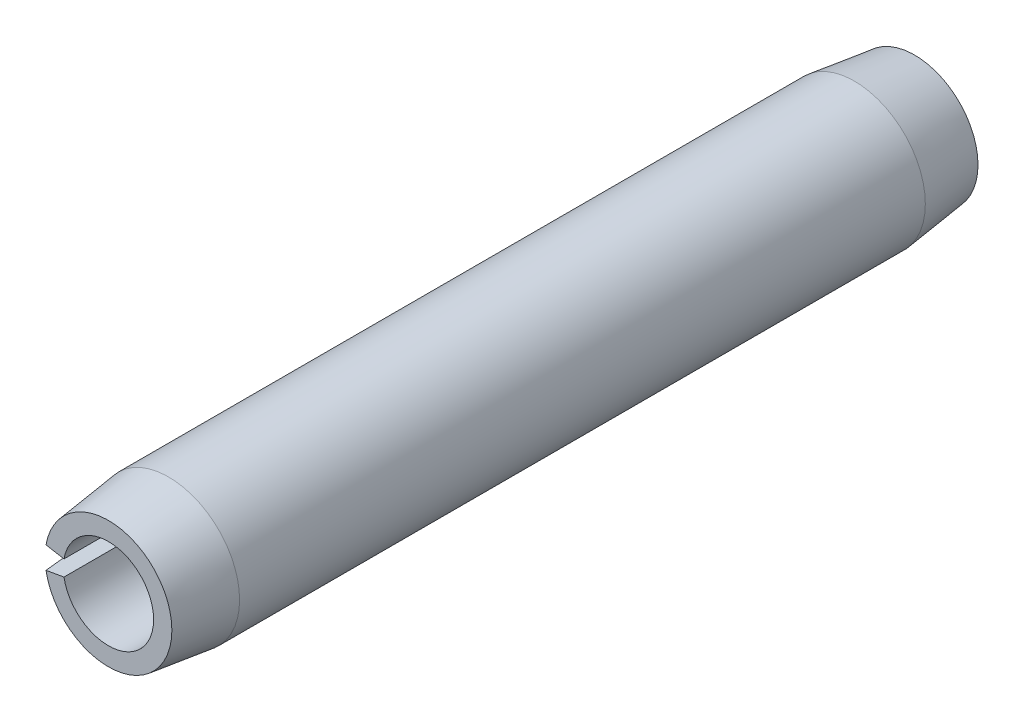
ISO-10303-21;
HEADER;
FILE_DESCRIPTION(('STEP AP214'),'2;1');
FILE_NAME('part.step','',(''),(''),'','','');
FILE_SCHEMA(('AUTOMOTIVE_DESIGN { 1 0 10303 214 1 1 1 1 }'));
ENDSEC;
DATA;
#1=APPLICATION_CONTEXT('core data for automotive mechanical design processes');
#2=APPLICATION_PROTOCOL_DEFINITION('international standard','automotive_design',2000,#1);
#3=PRODUCT_CONTEXT('',#1,'mechanical');
#4=PRODUCT('Part','Part','',(#3));
#5=PRODUCT_RELATED_PRODUCT_CATEGORY('part','',(#4));
#6=PRODUCT_DEFINITION_FORMATION('','',#4);
#7=PRODUCT_DEFINITION_CONTEXT('part definition',#1,'design');
#8=PRODUCT_DEFINITION('design','',#6,#7);
#9=PRODUCT_DEFINITION_SHAPE('','',#8);
#10=(LENGTH_UNIT() NAMED_UNIT(*) SI_UNIT(.MILLI.,.METRE.));
#11=(NAMED_UNIT(*) PLANE_ANGLE_UNIT() SI_UNIT($,.RADIAN.));
#12=(NAMED_UNIT(*) SI_UNIT($,.STERADIAN.) SOLID_ANGLE_UNIT());
#13=UNCERTAINTY_MEASURE_WITH_UNIT(LENGTH_MEASURE(1.E-05),#10,'distance_accuracy_value','');
#14=(GEOMETRIC_REPRESENTATION_CONTEXT(3) GLOBAL_UNCERTAINTY_ASSIGNED_CONTEXT((#13)) GLOBAL_UNIT_ASSIGNED_CONTEXT((#10,
#11,#12)) REPRESENTATION_CONTEXT('',''));
#15=CARTESIAN_POINT('',(0.,0.,0.));
#16=DIRECTION('',(0.,0.,1.));
#17=DIRECTION('',(1.,0.,0.));
#18=AXIS2_PLACEMENT_3D('',#15,#16,#17);
#19=CARTESIAN_POINT('',(0.,0.,4.7625));
#20=DIRECTION('',(0.,0.,-1.));
#21=DIRECTION('',(-1.,0.,0.));
#22=AXIS2_PLACEMENT_3D('',#19,#20,#21);
#23=CYLINDRICAL_SURFACE('',#22,0.5334);
#24=CARTESIAN_POINT('',(0.,0.,-4.7625));
#25=DIRECTION('',(0.,0.,-1.));
#26=DIRECTION('',(1.,0.,0.));
#27=AXIS2_PLACEMENT_3D('',#24,#25,#26);
#28=CIRCLE('',#27,0.5334);
#29=CARTESIAN_POINT('',(-0.525296455456712,0.0926239379675389,-4.7625));
#30=VERTEX_POINT('',#29);
#31=CARTESIAN_POINT('',(-0.525296455456712,-0.0926239379675389,-4.7625));
#32=VERTEX_POINT('',#31);
#33=EDGE_CURVE('E115',#30,#32,#28,.T.);
#34=ORIENTED_EDGE('',*,*,#33,.T.);
#35=DIRECTION('',(0.,0.,-1.));
#36=VECTOR('',#35,1.);
#37=CARTESIAN_POINT('',(-0.525296455456712,-0.0926239379675389,4.7625));
#38=LINE('',#37,#36);
#39=CARTESIAN_POINT('',(-0.525296455456712,-0.0926239379675389,4.7625));
#40=VERTEX_POINT('',#39);
#41=EDGE_CURVE('E11',#40,#32,#38,.T.);
#42=ORIENTED_EDGE('',*,*,#41,.F.);
#43=CARTESIAN_POINT('',(0.,0.,4.7625));
#44=DIRECTION('',(0.,0.,-1.));
#45=DIRECTION('',(1.,0.,0.));
#46=AXIS2_PLACEMENT_3D('',#43,#44,#45);
#47=CIRCLE('',#46,0.5334);
#48=CARTESIAN_POINT('',(-0.525296455456712,0.0926239379675389,4.7625));
#49=VERTEX_POINT('',#48);
#50=EDGE_CURVE('E111',#49,#40,#47,.T.);
#51=ORIENTED_EDGE('',*,*,#50,.F.);
#52=DIRECTION('',(0.,0.,-1.));
#53=VECTOR('',#52,1.);
#54=CARTESIAN_POINT('',(-0.525296455456712,0.0926239379675389,4.7625));
#55=LINE('',#54,#53);
#56=EDGE_CURVE('E104',#49,#30,#55,.T.);
#57=ORIENTED_EDGE('',*,*,#56,.T.);
#58=EDGE_LOOP('',(#34,#42,#51,#57));
#59=FACE_BOUND('',#58,.T.);
#60=ADVANCED_FACE('F32',(#59),#23,.F.);
#61=CARTESIAN_POINT('',(-0.525296455456712,-0.0926239379675389,4.7625));
#62=DIRECTION('',(0.173648177666927,-0.984807753012209,0.));
#63=DIRECTION('',(0.984807753012209,0.173648177666927,0.));
#64=AXIS2_PLACEMENT_3D('',#61,#62,#63);
#65=PLANE('',#64);
#66=DIRECTION('',(0.,0.,-1.));
#67=VECTOR('',#66,1.);
#68=CARTESIAN_POINT('',(-0.825465858574833,-0.145551902520418,4.7625));
#69=LINE('',#68,#67);
#70=CARTESIAN_POINT('',(-0.825465858574835,-0.145551902520419,4.0513));
#71=VERTEX_POINT('',#70);
#72=CARTESIAN_POINT('',(-0.825465858574835,-0.145551902520419,-4.0513));
#73=VERTEX_POINT('',#72);
#74=EDGE_CURVE('E39',#71,#73,#69,.T.);
#75=ORIENTED_EDGE('',*,*,#74,.F.);
#76=DIRECTION('',(-0.122150368266265,-0.0215384056288171,-0.992277876713668));
#77=VECTOR('',#76,1.);
#78=CARTESIAN_POINT('',(0.,0.,10.7569));
#79=LINE('',#78,#77);
#80=CARTESIAN_POINT('',(-0.737916449332049,-0.130114579525829,4.7625));
#81=VERTEX_POINT('',#80);
#82=EDGE_CURVE('E86',#71,#81,#79,.F.);
#83=ORIENTED_EDGE('',*,*,#82,.T.);
#84=DIRECTION('',(-0.984807753012209,-0.173648177666927,0.));
#85=VECTOR('',#84,1.);
#86=CARTESIAN_POINT('',(-0.525296455456712,-0.0926239379675389,4.7625));
#87=LINE('',#86,#85);
#88=EDGE_CURVE('E119',#40,#81,#87,.T.);
#89=ORIENTED_EDGE('',*,*,#88,.F.);
#90=ORIENTED_EDGE('',*,*,#41,.T.);
#91=DIRECTION('',(-0.984807753012209,-0.173648177666927,0.));
#92=VECTOR('',#91,1.);
#93=CARTESIAN_POINT('',(-0.525296455456712,-0.0926239379675389,-4.7625));
#94=LINE('',#93,#92);
#95=CARTESIAN_POINT('',(-0.737916449332049,-0.130114579525829,-4.7625));
#96=VERTEX_POINT('',#95);
#97=EDGE_CURVE('E112',#32,#96,#94,.T.);
#98=ORIENTED_EDGE('',*,*,#97,.T.);
#99=DIRECTION('',(0.122150368266265,0.0215384056288171,-0.992277876713668));
#100=VECTOR('',#99,1.);
#101=CARTESIAN_POINT('',(0.,0.,-10.7569));
#102=LINE('',#101,#100);
#103=EDGE_CURVE('E54',#96,#73,#102,.F.);
#104=ORIENTED_EDGE('',*,*,#103,.T.);
#105=EDGE_LOOP('',(#75,#83,#89,#90,#98,#104));
#106=FACE_BOUND('',#105,.T.);
#107=ADVANCED_FACE('F133',(#106),#65,.F.);
#108=CARTESIAN_POINT('',(0.,0.,4.7625));
#109=DIRECTION('',(0.,0.,-1.));
#110=DIRECTION('',(-1.,0.,0.));
#111=AXIS2_PLACEMENT_3D('',#108,#109,#110);
#112=CYLINDRICAL_SURFACE('',#111,0.8382);
#113=DIRECTION('',(0.,0.,-1.));
#114=VECTOR('',#113,1.);
#115=CARTESIAN_POINT('',(-0.825465858574833,0.145551902520418,4.7625));
#116=LINE('',#115,#114);
#117=CARTESIAN_POINT('',(-0.825465858574835,0.145551902520419,4.0513));
#118=VERTEX_POINT('',#117);
#119=CARTESIAN_POINT('',(-0.825465858574834,0.145551902520419,-4.0513));
#120=VERTEX_POINT('',#119);
#121=EDGE_CURVE('E96',#118,#120,#116,.T.);
#122=ORIENTED_EDGE('',*,*,#121,.F.);
#123=CARTESIAN_POINT('',(0.,0.,4.0513));
#124=DIRECTION('',(0.,0.,-1.));
#125=DIRECTION('',(-1.,0.,0.));
#126=AXIS2_PLACEMENT_3D('',#123,#124,#125);
#127=CIRCLE('',#126,0.838200000000002);
#128=EDGE_CURVE('E83',#118,#71,#127,.T.);
#129=ORIENTED_EDGE('',*,*,#128,.T.);
#130=ORIENTED_EDGE('',*,*,#74,.T.);
#131=CARTESIAN_POINT('',(0.,0.,-4.0513));
#132=DIRECTION('',(0.,0.,-1.));
#133=DIRECTION('',(-1.,0.,0.));
#134=AXIS2_PLACEMENT_3D('',#131,#132,#133);
#135=CIRCLE('',#134,0.838200000000002);
#136=EDGE_CURVE('E103',#120,#73,#135,.T.);
#137=ORIENTED_EDGE('',*,*,#136,.F.);
#138=EDGE_LOOP('',(#122,#129,#130,#137));
#139=FACE_BOUND('',#138,.T.);
#140=ADVANCED_FACE('F102',(#139),#112,.T.);
#141=CARTESIAN_POINT('',(-0.825465858574833,0.145551902520418,4.7625));
#142=DIRECTION('',(0.173648177666927,0.984807753012209,0.));
#143=DIRECTION('',(-0.984807753012209,0.173648177666927,0.));
#144=AXIS2_PLACEMENT_3D('',#141,#142,#143);
#145=PLANE('',#144);
#146=DIRECTION('',(0.984807753012209,-0.173648177666927,0.));
#147=VECTOR('',#146,1.);
#148=CARTESIAN_POINT('',(-0.825465858574833,0.145551902520418,4.7625));
#149=LINE('',#148,#147);
#150=CARTESIAN_POINT('',(-0.737916449332049,0.130114579525829,4.7625));
#151=VERTEX_POINT('',#150);
#152=EDGE_CURVE('E99',#151,#49,#149,.T.);
#153=ORIENTED_EDGE('',*,*,#152,.F.);
#154=DIRECTION('',(0.122150368266265,-0.0215384056288171,0.992277876713668));
#155=VECTOR('',#154,1.);
#156=CARTESIAN_POINT('',(0.,0.,10.7569));
#157=LINE('',#156,#155);
#158=EDGE_CURVE('E46',#151,#118,#157,.F.);
#159=ORIENTED_EDGE('',*,*,#158,.T.);
#160=ORIENTED_EDGE('',*,*,#121,.T.);
#161=DIRECTION('',(-0.122150368266265,0.0215384056288171,0.992277876713668));
#162=VECTOR('',#161,1.);
#163=CARTESIAN_POINT('',(0.,0.,-10.7569));
#164=LINE('',#163,#162);
#165=CARTESIAN_POINT('',(-0.737916449332049,0.130114579525829,-4.7625));
#166=VERTEX_POINT('',#165);
#167=EDGE_CURVE('E125',#120,#166,#164,.F.);
#168=ORIENTED_EDGE('',*,*,#167,.T.);
#169=DIRECTION('',(0.984807753012209,-0.173648177666927,0.));
#170=VECTOR('',#169,1.);
#171=CARTESIAN_POINT('',(-0.825465858574833,0.145551902520418,-4.7625));
#172=LINE('',#171,#170);
#173=EDGE_CURVE('E109',#166,#30,#172,.T.);
#174=ORIENTED_EDGE('',*,*,#173,.T.);
#175=ORIENTED_EDGE('',*,*,#56,.F.);
#176=EDGE_LOOP('',(#153,#159,#160,#168,#174,#175));
#177=FACE_BOUND('',#176,.T.);
#178=ADVANCED_FACE('F94',(#177),#145,.F.);
#179=CARTESIAN_POINT('',(0.,0.,4.7625));
#180=DIRECTION('',(0.,0.,1.));
#181=DIRECTION('',(1.,0.,0.));
#182=AXIS2_PLACEMENT_3D('',#179,#180,#181);
#183=PLANE('',#182);
#184=CARTESIAN_POINT('',(0.,0.,4.7625));
#185=DIRECTION('',(0.,0.,-1.));
#186=DIRECTION('',(-1.,0.,0.));
#187=AXIS2_PLACEMENT_3D('',#184,#185,#186);
#188=CIRCLE('',#187,0.749300000000001);
#189=EDGE_CURVE('E90',#151,#81,#188,.T.);
#190=ORIENTED_EDGE('',*,*,#189,.F.);
#191=ORIENTED_EDGE('',*,*,#152,.T.);
#192=ORIENTED_EDGE('',*,*,#50,.T.);
#193=ORIENTED_EDGE('',*,*,#88,.T.);
#194=EDGE_LOOP('',(#190,#191,#192,#193));
#195=FACE_BOUND('',#194,.T.);
#196=ADVANCED_FACE('F134',(#195),#183,.T.);
#197=CARTESIAN_POINT('',(0.,0.,-4.7625));
#198=DIRECTION('',(0.,0.,1.));
#199=DIRECTION('',(1.,0.,0.));
#200=AXIS2_PLACEMENT_3D('',#197,#198,#199);
#201=PLANE('',#200);
#202=ORIENTED_EDGE('',*,*,#173,.F.);
#203=CARTESIAN_POINT('',(0.,0.,-4.7625));
#204=DIRECTION('',(0.,0.,-1.));
#205=DIRECTION('',(-1.,0.,0.));
#206=AXIS2_PLACEMENT_3D('',#203,#204,#205);
#207=CIRCLE('',#206,0.749300000000001);
#208=EDGE_CURVE('E127',#166,#96,#207,.T.);
#209=ORIENTED_EDGE('',*,*,#208,.T.);
#210=ORIENTED_EDGE('',*,*,#97,.F.);
#211=ORIENTED_EDGE('',*,*,#33,.F.);
#212=EDGE_LOOP('',(#202,#209,#210,#211));
#213=FACE_BOUND('',#212,.T.);
#214=ADVANCED_FACE('F141',(#213),#201,.F.);
#215=CARTESIAN_POINT('',(0.,0.,-4.0513));
#216=DIRECTION('',(0.,0.,1.));
#217=DIRECTION('',(1.,0.,0.));
#218=AXIS2_PLACEMENT_3D('',#215,#216,#217);
#219=CONICAL_SURFACE('',#218,0.838200000000002,0.124354994546762);
#220=ORIENTED_EDGE('',*,*,#208,.F.);
#221=ORIENTED_EDGE('',*,*,#167,.F.);
#222=ORIENTED_EDGE('',*,*,#136,.T.);
#223=ORIENTED_EDGE('',*,*,#103,.F.);
#224=EDGE_LOOP('',(#220,#221,#222,#223));
#225=FACE_BOUND('',#224,.T.);
#226=ADVANCED_FACE('F142',(#225),#219,.T.);
#227=CARTESIAN_POINT('',(0.,0.,4.7625));
#228=DIRECTION('',(0.,0.,-1.));
#229=DIRECTION('',(-1.,0.,0.));
#230=AXIS2_PLACEMENT_3D('',#227,#228,#229);
#231=CONICAL_SURFACE('',#230,0.749300000000001,0.124354994546762);
#232=ORIENTED_EDGE('',*,*,#128,.F.);
#233=ORIENTED_EDGE('',*,*,#158,.F.);
#234=ORIENTED_EDGE('',*,*,#189,.T.);
#235=ORIENTED_EDGE('',*,*,#82,.F.);
#236=EDGE_LOOP('',(#232,#233,#234,#235));
#237=FACE_BOUND('',#236,.T.);
#238=ADVANCED_FACE('F84',(#237),#231,.T.);
#239=CLOSED_SHELL('',(#60,#107,#140,#178,#196,#214,#226,#238));
#240=MANIFOLD_SOLID_BREP('B2',#239);
#241=ADVANCED_BREP_SHAPE_REPRESENTATION('',(#18,#240),#14);
#242=SHAPE_DEFINITION_REPRESENTATION(#9,#241);
ENDSEC;
END-ISO-10303-21;
